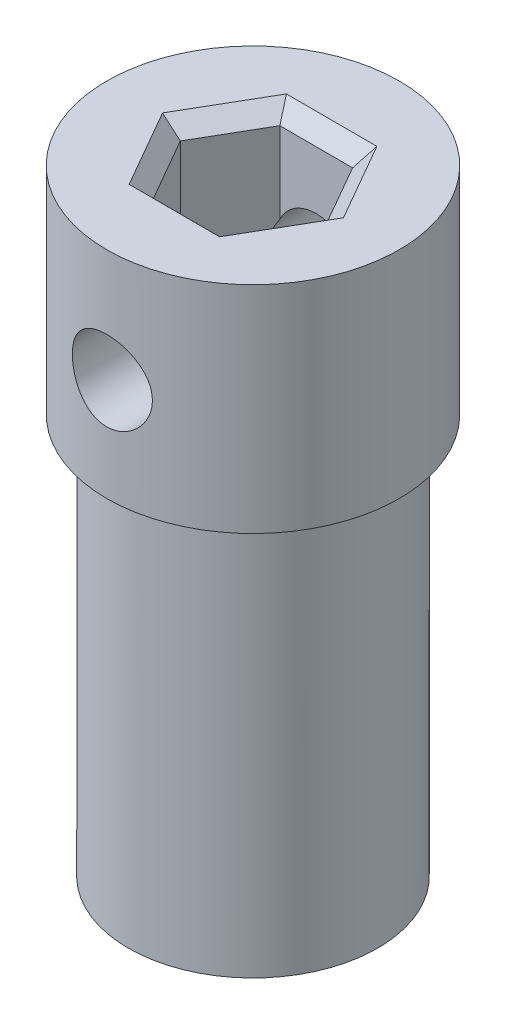
ISO-10303-21;
HEADER;
FILE_DESCRIPTION(('STEP AP214'),'2;1');
FILE_NAME('part.step','',(''),(''),'','','');
FILE_SCHEMA(('AUTOMOTIVE_DESIGN { 1 0 10303 214 1 1 1 1 }'));
ENDSEC;
DATA;
#1=APPLICATION_CONTEXT('core data for automotive mechanical design processes');
#2=APPLICATION_PROTOCOL_DEFINITION('international standard','automotive_design',2000,#1);
#3=PRODUCT_CONTEXT('',#1,'mechanical');
#4=PRODUCT('Part','Part','',(#3));
#5=PRODUCT_RELATED_PRODUCT_CATEGORY('part','',(#4));
#6=PRODUCT_DEFINITION_FORMATION('','',#4);
#7=PRODUCT_DEFINITION_CONTEXT('part definition',#1,'design');
#8=PRODUCT_DEFINITION('design','',#6,#7);
#9=PRODUCT_DEFINITION_SHAPE('','',#8);
#10=(LENGTH_UNIT() NAMED_UNIT(*) SI_UNIT(.MILLI.,.METRE.));
#11=(NAMED_UNIT(*) PLANE_ANGLE_UNIT() SI_UNIT($,.RADIAN.));
#12=(NAMED_UNIT(*) SI_UNIT($,.STERADIAN.) SOLID_ANGLE_UNIT());
#13=UNCERTAINTY_MEASURE_WITH_UNIT(LENGTH_MEASURE(1.E-05),#10,'distance_accuracy_value','');
#14=(GEOMETRIC_REPRESENTATION_CONTEXT(3) GLOBAL_UNCERTAINTY_ASSIGNED_CONTEXT((#13)) GLOBAL_UNIT_ASSIGNED_CONTEXT((#10,
#11,#12)) REPRESENTATION_CONTEXT('',''));
#15=CARTESIAN_POINT('',(0.,0.,0.));
#16=DIRECTION('',(0.,0.,1.));
#17=DIRECTION('',(1.,0.,0.));
#18=AXIS2_PLACEMENT_3D('',#15,#16,#17);
#19=CARTESIAN_POINT('',(1.18786890623597,20.,-2.04751087785415));
#20=DIRECTION('',(-0.00209924990421611,0.,0.999997796572492));
#21=DIRECTION('',(0.999997796572492,0.,0.00209924990421611));
#22=AXIS2_PLACEMENT_3D('',#19,#20,#21);
#23=PLANE('',#22);
#24=CARTESIAN_POINT('',(0.,16.3191525657327,-2.05000451703634));
#25=DIRECTION('',(-0.00209924990421611,0.,0.999997796572492));
#26=DIRECTION('',(-0.999997796572492,0.,-0.00209924990421611));
#27=AXIS2_PLACEMENT_3D('',#24,#25,#26);
#28=ELLIPSE('',#27,1.30000286446207,1.3);
#29=CARTESIAN_POINT('',(-1.17926198162869,15.7720317576059,-2.05248008809306));
#30=VERTEX_POINT('',#29);
#31=CARTESIAN_POINT('',(1.18786890623597,15.7909788617321,-2.04751087785415));
#32=VERTEX_POINT('',#31);
#33=EDGE_CURVE('E295',#30,#32,#28,.T.);
#34=ORIENTED_EDGE('',*,*,#33,.F.);
#35=DIRECTION('',(0.,-1.,0.));
#36=VECTOR('',#35,1.);
#37=CARTESIAN_POINT('',(-1.17926198162869,20.,-2.05248008809306));
#38=LINE('',#37,#36);
#39=CARTESIAN_POINT('',(-1.17926198162869,5.,-2.05248008809306));
#40=VERTEX_POINT('',#39);
#41=EDGE_CURVE('E179',#30,#40,#38,.T.);
#42=ORIENTED_EDGE('',*,*,#41,.T.);
#43=DIRECTION('',(-0.999997796572492,0.,-0.00209924990421611));
#44=VECTOR('',#43,1.);
#45=CARTESIAN_POINT('',(0.00430346230364303,5.,-2.04999548297361));
#46=LINE('',#45,#44);
#47=CARTESIAN_POINT('',(1.18786890623597,5.,-2.04751087785415));
#48=VERTEX_POINT('',#47);
#49=EDGE_CURVE('E173',#48,#40,#46,.T.);
#50=ORIENTED_EDGE('',*,*,#49,.F.);
#51=DIRECTION('',(0.,-1.,0.));
#52=VECTOR('',#51,1.);
#53=CARTESIAN_POINT('',(1.18786890623597,20.,-2.04751087785415));
#54=LINE('',#53,#52);
#55=EDGE_CURVE('E184',#32,#48,#54,.T.);
#56=ORIENTED_EDGE('',*,*,#55,.F.);
#57=EDGE_LOOP('',(#34,#42,#50,#56));
#58=FACE_BOUND('',#57,.T.);
#59=ADVANCED_FACE('F50',(#58),#23,.T.);
#60=CARTESIAN_POINT('',(-1.18786890623597,20.,2.04751087785415));
#61=DIRECTION('',(0.00209924990421593,0.,-0.999997796572492));
#62=DIRECTION('',(-0.999997796572492,0.,-0.00209924990421593));
#63=AXIS2_PLACEMENT_3D('',#60,#61,#62);
#64=PLANE('',#63);
#65=CARTESIAN_POINT('',(0.,16.3191525657327,2.05000451703634));
#66=DIRECTION('',(0.00209924990421593,0.,-0.999997796572492));
#67=DIRECTION('',(-0.999997796572492,0.,-0.00209924990421593));
#68=AXIS2_PLACEMENT_3D('',#65,#66,#67);
#69=ELLIPSE('',#68,1.30000286446207,1.3);
#70=CARTESIAN_POINT('',(-1.18786890623597,16.8473262697334,2.04751087785415));
#71=VERTEX_POINT('',#70);
#72=CARTESIAN_POINT('',(1.17926198162869,16.8662733738592,2.05248008809306));
#73=VERTEX_POINT('',#72);
#74=EDGE_CURVE('E78',#71,#73,#69,.T.);
#75=ORIENTED_EDGE('',*,*,#74,.F.);
#76=DIRECTION('',(0.,-1.,0.));
#77=VECTOR('',#76,1.);
#78=CARTESIAN_POINT('',(-1.18786890623597,20.,2.04751087785415));
#79=LINE('',#78,#77);
#80=CARTESIAN_POINT('',(-1.18786890623597,19.5,2.04751087785415));
#81=VERTEX_POINT('',#80);
#82=EDGE_CURVE('E172',#81,#71,#79,.T.);
#83=ORIENTED_EDGE('',*,*,#82,.F.);
#84=DIRECTION('',(0.999997796572492,0.,0.00209924990421593));
#85=VECTOR('',#84,1.);
#86=CARTESIAN_POINT('',(-1.18786890623597,19.5,2.04751087785415));
#87=LINE('',#86,#85);
#88=CARTESIAN_POINT('',(1.17926198162869,19.5,2.05248008809306));
#89=VERTEX_POINT('',#88);
#90=EDGE_CURVE('E210',#81,#89,#87,.T.);
#91=ORIENTED_EDGE('',*,*,#90,.T.);
#92=DIRECTION('',(0.,-1.,0.));
#93=VECTOR('',#92,1.);
#94=CARTESIAN_POINT('',(1.17926198162869,20.,2.05248008809306));
#95=LINE('',#94,#93);
#96=EDGE_CURVE('E169',#89,#73,#95,.T.);
#97=ORIENTED_EDGE('',*,*,#96,.T.);
#98=EDGE_LOOP('',(#75,#83,#91,#97));
#99=FACE_BOUND('',#98,.T.);
#100=ADVANCED_FACE('F264',(#99),#64,.T.);
#101=CARTESIAN_POINT('',(2.36713088786466,20.,0.00496921023891099));
#102=DIRECTION('',(-0.867073120512349,0.,0.498180894540304));
#103=DIRECTION('',(0.498180894540304,0.,0.867073120512349));
#104=AXIS2_PLACEMENT_3D('',#101,#102,#103);
#105=PLANE('',#104);
#106=CARTESIAN_POINT('',(0.,16.3191525657327,-4.11497113290881));
#107=DIRECTION('',(-0.867073120512349,0.,0.498180894540304));
#108=DIRECTION('',(-0.498180894540304,0.,-0.867073120512349));
#109=AXIS2_PLACEMENT_3D('',#106,#107,#108);
#110=ELLIPSE('',#109,2.60949388916164,1.3);
#111=CARTESIAN_POINT('',(1.18786890623597,16.8473262697332,-2.04751087785415));
#112=VERTEX_POINT('',#111);
#113=EDGE_CURVE('E219',#32,#112,#110,.T.);
#114=ORIENTED_EDGE('',*,*,#113,.F.);
#115=ORIENTED_EDGE('',*,*,#55,.T.);
#116=DIRECTION('',(-0.498180894540304,0.,-0.867073120512349));
#117=VECTOR('',#116,1.);
#118=CARTESIAN_POINT('',(1.77749989705032,5.,-1.02127083380762));
#119=LINE('',#118,#117);
#120=CARTESIAN_POINT('',(2.36713088786466,5.,0.00496921023891077));
#121=VERTEX_POINT('',#120);
#122=EDGE_CURVE('E329',#121,#48,#119,.T.);
#123=ORIENTED_EDGE('',*,*,#122,.F.);
#124=DIRECTION('',(0.,-1.,0.));
#125=VECTOR('',#124,1.);
#126=CARTESIAN_POINT('',(2.36713088786466,20.,0.00496921023891099));
#127=LINE('',#126,#125);
#128=CARTESIAN_POINT('',(2.36713088786466,19.5,0.00496921023891099));
#129=VERTEX_POINT('',#128);
#130=EDGE_CURVE('E166',#129,#121,#127,.T.);
#131=ORIENTED_EDGE('',*,*,#130,.F.);
#132=DIRECTION('',(-0.498180894540304,0.,-0.867073120512349));
#133=VECTOR('',#132,1.);
#134=CARTESIAN_POINT('',(2.36713088786466,19.5,0.00496921023891099));
#135=LINE('',#134,#133);
#136=CARTESIAN_POINT('',(1.18786890623597,19.5,-2.04751087785415));
#137=VERTEX_POINT('',#136);
#138=EDGE_CURVE('E213',#129,#137,#135,.T.);
#139=ORIENTED_EDGE('',*,*,#138,.T.);
#140=EDGE_CURVE('E183',#137,#112,#54,.T.);
#141=ORIENTED_EDGE('',*,*,#140,.T.);
#142=EDGE_LOOP('',(#114,#115,#123,#131,#139,#141));
#143=FACE_BOUND('',#142,.T.);
#144=ADVANCED_FACE('F272',(#143),#105,.T.);
#145=CARTESIAN_POINT('',(-1.17926198162869,16.8662733738594,-2.05248008809306));
#146=VERTEX_POINT('',#145);
#147=EDGE_CURVE('E68',#112,#146,#28,.T.);
#148=ORIENTED_EDGE('',*,*,#147,.F.);
#149=ORIENTED_EDGE('',*,*,#140,.F.);
#150=DIRECTION('',(-0.999997796572492,0.,-0.00209924990421611));
#151=VECTOR('',#150,1.);
#152=CARTESIAN_POINT('',(1.18786890623597,19.5,-2.04751087785415));
#153=LINE('',#152,#151);
#154=CARTESIAN_POINT('',(-1.17926198162869,19.5,-2.05248008809306));
#155=VERTEX_POINT('',#154);
#156=EDGE_CURVE('E214',#137,#155,#153,.T.);
#157=ORIENTED_EDGE('',*,*,#156,.T.);
#158=EDGE_CURVE('E182',#155,#146,#38,.T.);
#159=ORIENTED_EDGE('',*,*,#158,.T.);
#160=EDGE_LOOP('',(#148,#149,#157,#159));
#161=FACE_BOUND('',#160,.T.);
#162=ADVANCED_FACE('F268',(#161),#23,.T.);
#163=CARTESIAN_POINT('',(-1.17926198162869,20.,-2.05248008809306));
#164=DIRECTION('',(0.864973870608133,0.,0.50181690203219));
#165=DIRECTION('',(0.50181690203219,0.,-0.864973870608133));
#166=AXIS2_PLACEMENT_3D('',#163,#164,#165);
#167=PLANE('',#166);
#168=CARTESIAN_POINT('',(0.,16.3191525657327,-4.08515534590038));
#169=DIRECTION('',(0.864973870608133,0.,0.50181690203219));
#170=DIRECTION('',(0.50181690203219,0.,-0.864973870608133));
#171=AXIS2_PLACEMENT_3D('',#168,#169,#170);
#172=ELLIPSE('',#171,2.59058631691248,1.3);
#173=EDGE_CURVE('E291',#146,#30,#172,.T.);
#174=ORIENTED_EDGE('',*,*,#173,.F.);
#175=ORIENTED_EDGE('',*,*,#158,.F.);
#176=DIRECTION('',(-0.50181690203219,0.,0.864973870608133));
#177=VECTOR('',#176,1.);
#178=CARTESIAN_POINT('',(-1.17926198162869,19.5,-2.05248008809306));
#179=LINE('',#178,#177);
#180=CARTESIAN_POINT('',(-2.36713088786466,19.5,-0.00496921023891142));
#181=VERTEX_POINT('',#180);
#182=EDGE_CURVE('E207',#155,#181,#179,.T.);
#183=ORIENTED_EDGE('',*,*,#182,.T.);
#184=DIRECTION('',(0.,-1.,0.));
#185=VECTOR('',#184,1.);
#186=CARTESIAN_POINT('',(-2.36713088786466,20.,-0.00496921023891142));
#187=LINE('',#186,#185);
#188=CARTESIAN_POINT('',(-2.36713088786466,5.,-0.00496921023891142));
#189=VERTEX_POINT('',#188);
#190=EDGE_CURVE('E178',#181,#189,#187,.T.);
#191=ORIENTED_EDGE('',*,*,#190,.T.);
#192=DIRECTION('',(-0.50181690203219,0.,0.864973870608134));
#193=VECTOR('',#192,1.);
#194=CARTESIAN_POINT('',(-1.77319643474667,5.,-1.02872464916599));
#195=LINE('',#194,#193);
#196=EDGE_CURVE('E342',#40,#189,#195,.T.);
#197=ORIENTED_EDGE('',*,*,#196,.F.);
#198=ORIENTED_EDGE('',*,*,#41,.F.);
#199=EDGE_LOOP('',(#174,#175,#183,#191,#197,#198));
#200=FACE_BOUND('',#199,.T.);
#201=ADVANCED_FACE('F278',(#200),#167,.T.);
#202=CARTESIAN_POINT('',(-2.36713088786466,20.,-0.00496921023891142));
#203=DIRECTION('',(0.867073120512349,0.,-0.498180894540304));
#204=DIRECTION('',(-0.498180894540304,0.,-0.867073120512349));
#205=AXIS2_PLACEMENT_3D('',#202,#203,#204);
#206=PLANE('',#205);
#207=CARTESIAN_POINT('',(0.,16.3191525657327,4.11497113290866));
#208=DIRECTION('',(0.867073120512349,0.,-0.498180894540304));
#209=DIRECTION('',(-0.498180894540304,0.,-0.867073120512349));
#210=AXIS2_PLACEMENT_3D('',#207,#208,#209);
#211=ELLIPSE('',#210,2.60949388916164,1.3);
#212=CARTESIAN_POINT('',(-1.18786890623597,15.7909788617319,2.04751087785415));
#213=VERTEX_POINT('',#212);
#214=EDGE_CURVE('E325',#213,#71,#211,.T.);
#215=ORIENTED_EDGE('',*,*,#214,.F.);
#216=CARTESIAN_POINT('',(-1.18786890623597,5.,2.04751087785415));
#217=VERTEX_POINT('',#216);
#218=EDGE_CURVE('E165',#213,#217,#79,.T.);
#219=ORIENTED_EDGE('',*,*,#218,.T.);
#220=DIRECTION('',(0.498180894540304,0.,0.867073120512349));
#221=VECTOR('',#220,1.);
#222=CARTESIAN_POINT('',(-1.77749989705032,5.,1.02127083380762));
#223=LINE('',#222,#221);
#224=EDGE_CURVE('E341',#189,#217,#223,.T.);
#225=ORIENTED_EDGE('',*,*,#224,.F.);
#226=ORIENTED_EDGE('',*,*,#190,.F.);
#227=DIRECTION('',(0.498180894540304,0.,0.867073120512349));
#228=VECTOR('',#227,1.);
#229=CARTESIAN_POINT('',(-2.36713088786466,19.5,-0.00496921023891142));
#230=LINE('',#229,#228);
#231=EDGE_CURVE('E191',#181,#81,#230,.T.);
#232=ORIENTED_EDGE('',*,*,#231,.T.);
#233=ORIENTED_EDGE('',*,*,#82,.T.);
#234=EDGE_LOOP('',(#215,#219,#225,#226,#232,#233));
#235=FACE_BOUND('',#234,.T.);
#236=ADVANCED_FACE('F286',(#235),#206,.T.);
#237=CARTESIAN_POINT('',(1.17926198162869,15.7720317576061,2.05248008809306));
#238=VERTEX_POINT('',#237);
#239=EDGE_CURVE('E149',#238,#213,#69,.T.);
#240=ORIENTED_EDGE('',*,*,#239,.F.);
#241=CARTESIAN_POINT('',(1.17926198162869,5.,2.05248008809306));
#242=VERTEX_POINT('',#241);
#243=EDGE_CURVE('E159',#238,#242,#95,.T.);
#244=ORIENTED_EDGE('',*,*,#243,.T.);
#245=DIRECTION('',(0.999997796572492,0.,0.00209924990421593));
#246=VECTOR('',#245,1.);
#247=CARTESIAN_POINT('',(-0.00430346230364265,5.,2.04999548297361));
#248=LINE('',#247,#246);
#249=EDGE_CURVE('E339',#217,#242,#248,.T.);
#250=ORIENTED_EDGE('',*,*,#249,.F.);
#251=ORIENTED_EDGE('',*,*,#218,.F.);
#252=EDGE_LOOP('',(#240,#244,#250,#251));
#253=FACE_BOUND('',#252,.T.);
#254=ADVANCED_FACE('F158',(#253),#64,.T.);
#255=CARTESIAN_POINT('',(1.17926198162869,20.,2.05248008809306));
#256=DIRECTION('',(-0.864973870608134,0.,-0.501816902032189));
#257=DIRECTION('',(-0.501816902032189,0.,0.864973870608134));
#258=AXIS2_PLACEMENT_3D('',#255,#256,#257);
#259=PLANE('',#258);
#260=CARTESIAN_POINT('',(0.,16.3191525657327,4.08515534590052));
#261=DIRECTION('',(-0.864973870608134,0.,-0.501816902032189));
#262=DIRECTION('',(0.501816902032189,0.,-0.864973870608134));
#263=AXIS2_PLACEMENT_3D('',#260,#261,#262);
#264=ELLIPSE('',#263,2.59058631691248,1.3);
#265=EDGE_CURVE('E144',#73,#238,#264,.T.);
#266=ORIENTED_EDGE('',*,*,#265,.F.);
#267=ORIENTED_EDGE('',*,*,#96,.F.);
#268=DIRECTION('',(0.501816902032189,0.,-0.864973870608134));
#269=VECTOR('',#268,1.);
#270=CARTESIAN_POINT('',(1.17926198162869,19.5,2.05248008809306));
#271=LINE('',#270,#269);
#272=EDGE_CURVE('E211',#89,#129,#271,.T.);
#273=ORIENTED_EDGE('',*,*,#272,.T.);
#274=ORIENTED_EDGE('',*,*,#130,.T.);
#275=DIRECTION('',(0.501816902032189,0.,-0.864973870608134));
#276=VECTOR('',#275,1.);
#277=CARTESIAN_POINT('',(1.77319643474667,5.,1.02872464916599));
#278=LINE('',#277,#276);
#279=EDGE_CURVE('E170',#242,#121,#278,.T.);
#280=ORIENTED_EDGE('',*,*,#279,.F.);
#281=ORIENTED_EDGE('',*,*,#243,.F.);
#282=EDGE_LOOP('',(#266,#267,#273,#274,#280,#281));
#283=FACE_BOUND('',#282,.T.);
#284=ADVANCED_FACE('F164',(#283),#259,.T.);
#285=CARTESIAN_POINT('',(0.,20.,0.));
#286=DIRECTION('',(0.,1.,0.));
#287=DIRECTION('',(0.,0.,1.));
#288=AXIS2_PLACEMENT_3D('',#285,#286,#287);
#289=PLANE('',#288);
#290=DIRECTION('',(-0.999997796572492,0.,-0.00209924990421593));
#291=VECTOR('',#290,1.);
#292=CARTESIAN_POINT('',(-0.00535308725575063,20.,2.54999438125986));
#293=LINE('',#292,#291);
#294=CARTESIAN_POINT('',(1.46688685519667,20.,2.55308498762797));
#295=VERTEX_POINT('',#294);
#296=CARTESIAN_POINT('',(-1.47759302970817,20.,2.54690377489176));
#297=VERTEX_POINT('',#296);
#298=EDGE_CURVE('E205',#295,#297,#293,.T.);
#299=ORIENTED_EDGE('',*,*,#298,.T.);
#300=DIRECTION('',(-0.498180894540304,0.,-0.867073120512349));
#301=VECTOR('',#300,1.);
#302=CARTESIAN_POINT('',(-2.2110364573065,20.,1.27036128107778));
#303=LINE('',#302,#301);
#304=CARTESIAN_POINT('',(-2.94447988490483,20.,-0.00618121273620792));
#305=VERTEX_POINT('',#304);
#306=EDGE_CURVE('E204',#297,#305,#303,.T.);
#307=ORIENTED_EDGE('',*,*,#306,.T.);
#308=DIRECTION('',(0.50181690203219,0.,-0.864973870608133));
#309=VECTOR('',#308,1.);
#310=CARTESIAN_POINT('',(-2.20568337005075,20.,-1.27963310018209));
#311=LINE('',#310,#309);
#312=CARTESIAN_POINT('',(-1.46688685519667,20.,-2.55308498762797));
#313=VERTEX_POINT('',#312);
#314=EDGE_CURVE('E199',#305,#313,#311,.T.);
#315=ORIENTED_EDGE('',*,*,#314,.T.);
#316=DIRECTION('',(0.999997796572492,0.,0.00209924990421611));
#317=VECTOR('',#316,1.);
#318=CARTESIAN_POINT('',(0.0053530872557511,20.,-2.54999438125986));
#319=LINE('',#318,#317);
#320=CARTESIAN_POINT('',(1.47759302970817,20.,-2.54690377489176));
#321=VERTEX_POINT('',#320);
#322=EDGE_CURVE('E192',#313,#321,#319,.T.);
#323=ORIENTED_EDGE('',*,*,#322,.T.);
#324=DIRECTION('',(0.498180894540304,0.,0.867073120512349));
#325=VECTOR('',#324,1.);
#326=CARTESIAN_POINT('',(2.2110364573065,20.,-1.27036128107778));
#327=LINE('',#326,#325);
#328=CARTESIAN_POINT('',(2.94447988490483,20.,0.00618121273620698));
#329=VERTEX_POINT('',#328);
#330=EDGE_CURVE('E198',#321,#329,#327,.T.);
#331=ORIENTED_EDGE('',*,*,#330,.T.);
#332=DIRECTION('',(-0.501816902032189,0.,0.864973870608134));
#333=VECTOR('',#332,1.);
#334=CARTESIAN_POINT('',(2.20568337005075,20.,1.27963310018209));
#335=LINE('',#334,#333);
#336=EDGE_CURVE('E196',#329,#295,#335,.T.);
#337=ORIENTED_EDGE('',*,*,#336,.T.);
#338=EDGE_LOOP('',(#299,#307,#315,#323,#331,#337));
#339=FACE_BOUND('',#338,.T.);
#340=CARTESIAN_POINT('',(0.,20.,0.));
#341=DIRECTION('',(0.,1.,0.));
#342=DIRECTION('',(0.,0.,1.));
#343=AXIS2_PLACEMENT_3D('',#340,#341,#342);
#344=CIRCLE('',#343,4.75);
#345=CARTESIAN_POINT('',(0.,20.,4.75));
#346=VERTEX_POINT('',#345);
#347=EDGE_CURVE('E233',#346,#346,#344,.F.);
#348=ORIENTED_EDGE('',*,*,#347,.F.);
#349=EDGE_LOOP('',(#348));
#350=FACE_BOUND('',#349,.T.);
#351=ADVANCED_FACE('F313',(#339,#350),#289,.T.);
#352=CARTESIAN_POINT('',(0.,5.,0.));
#353=DIRECTION('',(0.,-1.,0.));
#354=DIRECTION('',(0.,0.,-1.));
#355=AXIS2_PLACEMENT_3D('',#352,#353,#354);
#356=PLANE('',#355);
#357=ORIENTED_EDGE('',*,*,#122,.T.);
#358=ORIENTED_EDGE('',*,*,#49,.T.);
#359=ORIENTED_EDGE('',*,*,#196,.T.);
#360=ORIENTED_EDGE('',*,*,#224,.T.);
#361=ORIENTED_EDGE('',*,*,#249,.T.);
#362=ORIENTED_EDGE('',*,*,#279,.T.);
#363=EDGE_LOOP('',(#357,#358,#359,#360,#361,#362));
#364=FACE_BOUND('',#363,.T.);
#365=ADVANCED_FACE('F257',(#364),#356,.F.);
#366=CARTESIAN_POINT('',(0.,33.4350288425444,0.));
#367=DIRECTION('',(0.,-1.,0.));
#368=DIRECTION('',(0.,0.,-1.));
#369=AXIS2_PLACEMENT_3D('',#366,#367,#368);
#370=CYLINDRICAL_SURFACE('',#369,4.75);
#371=CARTESIAN_POINT('',(0.,15.0191525657327,4.75));
#372=CARTESIAN_POINT('',(0.0715951003584682,15.0191541153011,4.74999899440994));
#373=CARTESIAN_POINT('',(0.143206537717279,15.0250868089565,4.74836546774173));
#374=CARTESIAN_POINT('',(0.284361914079167,15.048615970725,4.74200782452498));
#375=CARTESIAN_POINT('',(0.353904920890683,15.0662176169594,4.7372823359242));
#376=CARTESIAN_POINT('',(0.488865863752297,15.1124661183561,4.72526158229014));
#377=CARTESIAN_POINT('',(0.554289142292481,15.1410983109154,4.71796972976162));
#378=CARTESIAN_POINT('',(0.679405453502896,15.2085396003838,4.7015842748338));
#379=CARTESIAN_POINT('',(0.739098023693319,15.2473495177144,4.69249052719904));
#380=CARTESIAN_POINT('',(0.852509735939152,15.3350404564927,4.67323349477973));
#381=CARTESIAN_POINT('',(0.906069718621598,15.3841231407949,4.66305117109811));
#382=CARTESIAN_POINT('',(1.00431011989641,15.4905355201862,4.64288504590069));
#383=CARTESIAN_POINT('',(1.04898932960238,15.5478663362155,4.63290127157846));
#384=CARTESIAN_POINT('',(1.1289881717719,15.6704332715712,4.61406659652621));
#385=CARTESIAN_POINT('',(1.16412246881579,15.7357943785959,4.60523964721438));
#386=CARTESIAN_POINT('',(1.22283955196175,15.8717768820564,4.58999892053115));
#387=CARTESIAN_POINT('',(1.24642459490571,15.9423972476698,4.58358467175034));
#388=CARTESIAN_POINT('',(1.28081663959482,16.0851257171666,4.57409253234305));
#389=CARTESIAN_POINT('',(1.29191322126778,16.1571588999447,4.57093917601155));
#390=CARTESIAN_POINT('',(1.30191648215987,16.3021281584736,4.56810057125313));
#391=CARTESIAN_POINT('',(1.30082557129907,16.3750640528756,4.56841463718784));
#392=CARTESIAN_POINT('',(1.28671421367188,16.5174896160399,4.57240798168314));
#393=CARTESIAN_POINT('',(1.27404658503496,16.5870174797495,4.57598772797946));
#394=CARTESIAN_POINT('',(1.23770745870347,16.7229212005909,4.58594938346629));
#395=CARTESIAN_POINT('',(1.21403503985192,16.7892967933487,4.59233152722927));
#396=CARTESIAN_POINT('',(1.15607648350299,16.917919968221,4.60726473432184));
#397=CARTESIAN_POINT('',(1.12166854684569,16.9801096806638,4.61584047283149));
#398=CARTESIAN_POINT('',(1.04330056314014,17.0979554147175,4.63418162186477));
#399=CARTESIAN_POINT('',(0.99933854590106,17.1536100850557,4.64394727758393));
#400=CARTESIAN_POINT('',(0.901316726901487,17.2588188814548,4.66398009787052));
#401=CARTESIAN_POINT('',(0.846961318710026,17.308096916348,4.67425295164488));
#402=CARTESIAN_POINT('',(0.730631864203716,17.3968963263787,4.69384182527964));
#403=CARTESIAN_POINT('',(0.668657485256591,17.4364172753104,4.70315780333174));
#404=CARTESIAN_POINT('',(0.538406899675957,17.5047112704396,4.71984573129678));
#405=CARTESIAN_POINT('',(0.470102014630273,17.5334320938325,4.72720818597995));
#406=CARTESIAN_POINT('',(0.329385290712426,17.578902150229,4.73909098809721));
#407=CARTESIAN_POINT('',(0.256974402941992,17.5956541435272,4.74361199080819));
#408=CARTESIAN_POINT('',(0.112455507060578,17.6162722768452,4.74920247292855));
#409=CARTESIAN_POINT('',(0.0404048200082267,17.6205135324254,4.75037239727299));
#410=CARTESIAN_POINT('',(-0.103379144914037,17.6170288399728,4.74941887594665));
#411=CARTESIAN_POINT('',(-0.175112456620315,17.6093042000753,4.74729579027414));
#412=CARTESIAN_POINT('',(-0.314871076949878,17.5824138988914,4.74005987984794));
#413=CARTESIAN_POINT('',(-0.382940152351009,17.5634594735669,4.73500228950889));
#414=CARTESIAN_POINT('',(-0.514924300836631,17.5148947197124,4.72247303032738));
#415=CARTESIAN_POINT('',(-0.578838911066989,17.4852832062572,4.71500109305138));
#416=CARTESIAN_POINT('',(-0.702141923591819,17.4155625669063,4.69823904122434));
#417=CARTESIAN_POINT('',(-0.761411711280475,17.3752520281184,4.68891501303483));
#418=CARTESIAN_POINT('',(-0.872476630564392,17.2855290332981,4.6695255028463));
#419=CARTESIAN_POINT('',(-0.924270200395693,17.2361146803941,4.65945986658853));
#420=CARTESIAN_POINT('',(-1.02050795705685,17.1278330474972,4.63934867361868));
#421=CARTESIAN_POINT('',(-1.0646869213105,17.0687278174159,4.6293126668116));
#422=CARTESIAN_POINT('',(-1.14250771994196,16.9437286214798,4.61072476911711));
#423=CARTESIAN_POINT('',(-1.17614997265281,16.8778349252817,4.60217281931504));
#424=CARTESIAN_POINT('',(-1.23169061965019,16.7414410919005,4.58762063029747));
#425=CARTESIAN_POINT('',(-1.2536553906961,16.6709696023547,4.58160600973182));
#426=CARTESIAN_POINT('',(-1.28536406327468,16.5271392573441,4.57281260843628));
#427=CARTESIAN_POINT('',(-1.295111293101,16.4537811938566,4.57003294645611));
#428=CARTESIAN_POINT('',(-1.30190937016433,16.3089830618886,4.56810054957139));
#429=CARTESIAN_POINT('',(-1.29938763462395,16.2375643973341,4.56882571029196));
#430=CARTESIAN_POINT('',(-1.28271663157227,16.0962123142462,4.57353380900221));
#431=CARTESIAN_POINT('',(-1.26856769416037,16.0262788536052,4.57751665450532));
#432=CARTESIAN_POINT('',(-1.22929772094044,15.8904525069768,4.58821673046088));
#433=CARTESIAN_POINT('',(-1.20427180901376,15.824530115881,4.59491022126172));
#434=CARTESIAN_POINT('',(-1.14403192755671,15.6977689396739,4.61027687969974));
#435=CARTESIAN_POINT('',(-1.10881628339131,15.6369309922873,4.61895037269155));
#436=CARTESIAN_POINT('',(-1.02792053161027,15.5200367558106,4.63763415296583));
#437=CARTESIAN_POINT('',(-0.981950946367112,15.464186051045,4.64767744149082));
#438=CARTESIAN_POINT('',(-0.881396780304759,15.3608526217622,4.66779008554348));
#439=CARTESIAN_POINT('',(-0.826810082526995,15.3133719595894,4.67785944687695));
#440=CARTESIAN_POINT('',(-0.709063460062277,15.2270544437435,4.69716556994259));
#441=CARTESIAN_POINT('',(-0.645735853814162,15.1884403978401,4.70637798882931));
#442=CARTESIAN_POINT('',(-0.513236994525068,15.1224666275332,4.72266130243398));
#443=CARTESIAN_POINT('',(-0.444069324085395,15.0951000629382,4.72973349804341));
#444=CARTESIAN_POINT('',(-0.31268558688025,15.0557470341646,4.74008364222336));
#445=CARTESIAN_POINT('',(-0.251007090363235,15.0420570006412,4.74377447109986));
#446=CARTESIAN_POINT('',(-0.126223189317632,15.0237595854062,4.748732959314));
#447=CARTESIAN_POINT('',(-0.063117943308976,15.0191511996396,4.75000088652402));
#448=CARTESIAN_POINT('',(0.,15.0191525657327,4.75));
#449=B_SPLINE_CURVE_WITH_KNOTS('',3,(#371,#372,#373,#374,#375,#376,#377,#378,#379,#380,#381,
#382,#383,#384,#385,#386,#387,#388,#389,#390,#391,#392,#393,#394,#395,#396,#397,#398,#399,#400,
#401,#402,#403,#404,#405,#406,#407,#408,#409,#410,#411,#412,#413,#414,#415,#416,#417,#418,#419,
#420,#421,#422,#423,#424,#425,#426,#427,#428,#429,#430,#431,#432,#433,#434,#435,#436,#437,#438,
#439,#440,#441,#442,#443,#444,#445,#446,#447,#448),.UNSPECIFIED.,.T.,.F.,(4,2,2,2,2,2,2,2,2,2,2,
2,2,2,2,2,2,2,2,2,2,2,2,2,2,2,2,2,2,2,2,2,2,2,2,2,2,2,4),(0.,0.214553756688464,
0.429202785825955,0.643567466942959,0.857949433208487,1.0770191770696,1.29611872119019,
1.51920969740667,1.74225706196029,1.96001843669451,2.17773675267682,2.38903333215547,
2.60034760141902,2.81415229883656,3.0280011278091,3.24921438650876,3.47043730646332,
3.6927165751415,3.91494456441531,4.13043803387268,4.34590794682475,4.55744802377737,
4.76901162841968,4.98488167425051,5.20079674975647,5.42315056701215,5.6454955551614,
5.86656280611601,6.08756982099399,6.30093382834366,6.51429177844098,6.72582022678132,
6.93738345860129,7.15547761247439,7.37362542897072,7.59676812915135,7.81977492286229,
8.00894553984856,8.19809524120503),.UNSPECIFIED.);
#450=CARTESIAN_POINT('',(0.,15.0191525657327,4.75));
#451=VERTEX_POINT('',#450);
#452=EDGE_CURVE('E11',#451,#451,#449,.T.);
#453=ORIENTED_EDGE('',*,*,#452,.F.);
#454=EDGE_LOOP('',(#453));
#455=FACE_BOUND('',#454,.T.);
#456=CARTESIAN_POINT('',(0.,17.6191525657327,-4.75));
#457=CARTESIAN_POINT('',(0.0715951003584682,17.6191510161642,-4.74999899440994));
#458=CARTESIAN_POINT('',(0.143206537717279,17.6132183225089,-4.74836546774173));
#459=CARTESIAN_POINT('',(0.284361914079166,17.5896891607403,-4.74200782452498));
#460=CARTESIAN_POINT('',(0.353904920890683,17.5720875145059,-4.7372823359242));
#461=CARTESIAN_POINT('',(0.488865863752298,17.5258390131093,-4.72526158229014));
#462=CARTESIAN_POINT('',(0.554289142292483,17.4972068205499,-4.71796972976162));
#463=CARTESIAN_POINT('',(0.679405453502898,17.4297655310815,-4.7015842748338));
#464=CARTESIAN_POINT('',(0.73909802369332,17.3909556137509,-4.69249052719904));
#465=CARTESIAN_POINT('',(0.852509735939154,17.3032646749726,-4.67323349477973));
#466=CARTESIAN_POINT('',(0.9060697186216,17.2541819906704,-4.66305117109811));
#467=CARTESIAN_POINT('',(1.00431011989641,17.1477696112791,-4.64288504590069));
#468=CARTESIAN_POINT('',(1.04898932960238,17.0904387952498,-4.63290127157847));
#469=CARTESIAN_POINT('',(1.1289881717719,16.9678718598942,-4.61406659652621));
#470=CARTESIAN_POINT('',(1.16412246881579,16.9025107528695,-4.60523964721438));
#471=CARTESIAN_POINT('',(1.22283955196175,16.7665282494089,-4.58999892053115));
#472=CARTESIAN_POINT('',(1.24642459490571,16.6959078837956,-4.58358467175034));
#473=CARTESIAN_POINT('',(1.28081663959482,16.5531794142987,-4.57409253234305));
#474=CARTESIAN_POINT('',(1.29191322126778,16.4811462315206,-4.57093917601155));
#475=CARTESIAN_POINT('',(1.30191648215987,16.3361769729918,-4.56810057125313));
#476=CARTESIAN_POINT('',(1.30082557129907,16.2632410785897,-4.56841463718784));
#477=CARTESIAN_POINT('',(1.28671421367188,16.1208155154254,-4.57240798168314));
#478=CARTESIAN_POINT('',(1.27404658503496,16.0512876517158,-4.57598772797945));
#479=CARTESIAN_POINT('',(1.23770745870347,15.9153839308745,-4.58594938346629));
#480=CARTESIAN_POINT('',(1.21403503985192,15.8490083381166,-4.59233152722927));
#481=CARTESIAN_POINT('',(1.15607648350299,15.7203851632443,-4.60726473432184));
#482=CARTESIAN_POINT('',(1.12166854684569,15.6581954508015,-4.61584047283149));
#483=CARTESIAN_POINT('',(1.04330056314014,15.5403497167479,-4.63418162186477));
#484=CARTESIAN_POINT('',(0.999338545901057,15.4846950464096,-4.64394727758393));
#485=CARTESIAN_POINT('',(0.901316726901483,15.3794862500105,-4.66398009787052));
#486=CARTESIAN_POINT('',(0.846961318710021,15.3302082151173,-4.67425295164488));
#487=CARTESIAN_POINT('',(0.730631864203712,15.2414088050866,-4.69384182527964));
#488=CARTESIAN_POINT('',(0.668657485256588,15.2018878561549,-4.70315780333174));
#489=CARTESIAN_POINT('',(0.538406899675955,15.1335938610257,-4.71984573129678));
#490=CARTESIAN_POINT('',(0.470102014630271,15.1048730376328,-4.72720818597995));
#491=CARTESIAN_POINT('',(0.329385290712425,15.0594029812363,-4.73909098809721));
#492=CARTESIAN_POINT('',(0.256974402941993,15.0426509879382,-4.74361199080819));
#493=CARTESIAN_POINT('',(0.11245550706058,15.0220328546201,-4.74920247292855));
#494=CARTESIAN_POINT('',(0.0404048200082283,15.01779159904,-4.75037239727299));
#495=CARTESIAN_POINT('',(-0.103379144914035,15.0212762914925,-4.74941887594665));
#496=CARTESIAN_POINT('',(-0.175112456620315,15.02900093139,-4.74729579027414));
#497=CARTESIAN_POINT('',(-0.314871076949878,15.0558912325739,-4.74005987984794));
#498=CARTESIAN_POINT('',(-0.382940152351009,15.0748456578985,-4.73500228950889));
#499=CARTESIAN_POINT('',(-0.514924300836631,15.1234104117529,-4.72247303032738));
#500=CARTESIAN_POINT('',(-0.578838911066989,15.1530219252082,-4.71500109305138));
#501=CARTESIAN_POINT('',(-0.702141923591819,15.222742564559,-4.69823904122434));
#502=CARTESIAN_POINT('',(-0.761411711280473,15.2630531033469,-4.68891501303483));
#503=CARTESIAN_POINT('',(-0.872476630564391,15.3527760981672,-4.6695255028463));
#504=CARTESIAN_POINT('',(-0.924270200395693,15.4021904510712,-4.65945986658853));
#505=CARTESIAN_POINT('',(-1.02050795705685,15.5104720839681,-4.63934867361868));
#506=CARTESIAN_POINT('',(-1.0646869213105,15.5695773140494,-4.6293126668116));
#507=CARTESIAN_POINT('',(-1.14250771994196,15.6945765099855,-4.61072476911711));
#508=CARTESIAN_POINT('',(-1.17614997265281,15.7604702061837,-4.60217281931504));
#509=CARTESIAN_POINT('',(-1.23169061965019,15.8968640395648,-4.58762063029747));
#510=CARTESIAN_POINT('',(-1.2536553906961,15.9673355291106,-4.58160600973182));
#511=CARTESIAN_POINT('',(-1.28536406327468,16.1111658741212,-4.57281260843628));
#512=CARTESIAN_POINT('',(-1.295111293101,16.1845239376088,-4.57003294645611));
#513=CARTESIAN_POINT('',(-1.30190937016433,16.3293220695768,-4.56810054957139));
#514=CARTESIAN_POINT('',(-1.29938763462395,16.4007407341313,-4.56882571029196));
#515=CARTESIAN_POINT('',(-1.28271663157227,16.5420928172192,-4.57353380900221));
#516=CARTESIAN_POINT('',(-1.26856769416037,16.6120262778601,-4.57751665450532));
#517=CARTESIAN_POINT('',(-1.22929772094044,16.7478526244885,-4.58821673046088));
#518=CARTESIAN_POINT('',(-1.20427180901376,16.8137750155844,-4.59491022126172));
#519=CARTESIAN_POINT('',(-1.14403192755671,16.9405361917914,-4.61027687969974));
#520=CARTESIAN_POINT('',(-1.10881628339131,17.001374139178,-4.61895037269155));
#521=CARTESIAN_POINT('',(-1.02792053161027,17.1182683756547,-4.63763415296583));
#522=CARTESIAN_POINT('',(-0.981950946367111,17.1741190804204,-4.64767744149082));
#523=CARTESIAN_POINT('',(-0.881396780304758,17.2774525097031,-4.66779008554348));
#524=CARTESIAN_POINT('',(-0.826810082526994,17.324933171876,-4.67785944687695));
#525=CARTESIAN_POINT('',(-0.709063460062278,17.4112506877218,-4.69716556994259));
#526=CARTESIAN_POINT('',(-0.645735853814163,17.4498647336252,-4.70637798882931));
#527=CARTESIAN_POINT('',(-0.51323699452507,17.5158385039321,-4.72266130243398));
#528=CARTESIAN_POINT('',(-0.444069324085397,17.5432050685272,-4.72973349804341));
#529=CARTESIAN_POINT('',(-0.312685586880252,17.5825580973007,-4.74008364222336));
#530=CARTESIAN_POINT('',(-0.251007090363238,17.5962481308242,-4.74377447109986));
#531=CARTESIAN_POINT('',(-0.126223189317634,17.6145455460591,-4.748732959314));
#532=CARTESIAN_POINT('',(-0.0631179433089767,17.6191539318258,-4.75000088652402));
#533=CARTESIAN_POINT('',(0.,17.6191525657327,-4.75));
#534=B_SPLINE_CURVE_WITH_KNOTS('',3,(#456,#457,#458,#459,#460,#461,#462,#463,#464,#465,#466,
#467,#468,#469,#470,#471,#472,#473,#474,#475,#476,#477,#478,#479,#480,#481,#482,#483,#484,#485,
#486,#487,#488,#489,#490,#491,#492,#493,#494,#495,#496,#497,#498,#499,#500,#501,#502,#503,#504,
#505,#506,#507,#508,#509,#510,#511,#512,#513,#514,#515,#516,#517,#518,#519,#520,#521,#522,#523,
#524,#525,#526,#527,#528,#529,#530,#531,#532,#533),.UNSPECIFIED.,.T.,.F.,(4,2,2,2,2,2,2,2,2,2,2,
2,2,2,2,2,2,2,2,2,2,2,2,2,2,2,2,2,2,2,2,2,2,2,2,2,2,2,4),(0.,0.214553756688464,
0.429202785825955,0.643567466942962,0.857949433208488,1.0770191770696,1.29611872119019,
1.51920969740667,1.74225706196029,1.96001843669451,2.17773675267682,2.38903333215548,
2.60034760141903,2.81415229883656,3.02800112780911,3.24921438650876,3.47043730646332,
3.6927165751415,3.9149445644153,4.13043803387268,4.34590794682475,4.55744802377737,
4.76901162841968,4.98488167425051,5.20079674975647,5.42315056701214,5.6454955551614,
5.86656280611601,6.08756982099399,6.30093382834366,6.51429177844098,6.72582022678132,
6.93738345860129,7.15547761247439,7.37362542897072,7.59676812915135,7.81977492286229,
8.00894553984856,8.19809524120503),.UNSPECIFIED.);
#535=CARTESIAN_POINT('',(0.,17.6191525657327,-4.75));
#536=VERTEX_POINT('',#535);
#537=EDGE_CURVE('E63',#536,#536,#534,.T.);
#538=ORIENTED_EDGE('',*,*,#537,.F.);
#539=EDGE_LOOP('',(#538));
#540=FACE_BOUND('',#539,.T.);
#541=CARTESIAN_POINT('',(0.,13.,0.));
#542=DIRECTION('',(0.,-1.,0.));
#543=DIRECTION('',(0.,0.,-1.));
#544=AXIS2_PLACEMENT_3D('',#541,#542,#543);
#545=CIRCLE('',#544,4.75);
#546=CARTESIAN_POINT('',(0.,13.,-4.75));
#547=VERTEX_POINT('',#546);
#548=EDGE_CURVE('E330',#547,#547,#545,.T.);
#549=ORIENTED_EDGE('',*,*,#548,.F.);
#550=EDGE_LOOP('',(#549));
#551=FACE_BOUND('',#550,.T.);
#552=ORIENTED_EDGE('',*,*,#347,.T.);
#553=EDGE_LOOP('',(#552));
#554=FACE_BOUND('',#553,.T.);
#555=ADVANCED_FACE('F236',(#455,#540,#551,#554),#370,.T.);
#556=CARTESIAN_POINT('',(0.,13.,0.));
#557=DIRECTION('',(0.,-1.,0.));
#558=DIRECTION('',(0.,0.,-1.));
#559=AXIS2_PLACEMENT_3D('',#556,#557,#558);
#560=PLANE('',#559);
#561=CARTESIAN_POINT('',(0.,13.,0.));
#562=DIRECTION('',(0.,-1.,0.));
#563=DIRECTION('',(0.,0.,-1.));
#564=AXIS2_PLACEMENT_3D('',#561,#562,#563);
#565=CIRCLE('',#564,4.05);
#566=CARTESIAN_POINT('',(0.,13.,-4.05));
#567=VERTEX_POINT('',#566);
#568=EDGE_CURVE('E332',#567,#567,#565,.T.);
#569=ORIENTED_EDGE('',*,*,#568,.F.);
#570=EDGE_LOOP('',(#569));
#571=FACE_BOUND('',#570,.T.);
#572=ORIENTED_EDGE('',*,*,#548,.T.);
#573=EDGE_LOOP('',(#572));
#574=FACE_BOUND('',#573,.T.);
#575=ADVANCED_FACE('F246',(#571,#574),#560,.T.);
#576=CARTESIAN_POINT('',(0.,0.,0.));
#577=DIRECTION('',(0.,1.,0.));
#578=DIRECTION('',(0.,0.,1.));
#579=AXIS2_PLACEMENT_3D('',#576,#577,#578);
#580=PLANE('',#579);
#581=CARTESIAN_POINT('',(0.,0.,0.));
#582=DIRECTION('',(0.,1.,0.));
#583=DIRECTION('',(0.,0.,1.));
#584=AXIS2_PLACEMENT_3D('',#581,#582,#583);
#585=CIRCLE('',#584,4.05);
#586=CARTESIAN_POINT('',(0.,0.,4.05));
#587=VERTEX_POINT('',#586);
#588=EDGE_CURVE('E186',#587,#587,#585,.T.);
#589=ORIENTED_EDGE('',*,*,#588,.F.);
#590=EDGE_LOOP('',(#589));
#591=FACE_BOUND('',#590,.T.);
#592=ADVANCED_FACE('F247',(#591),#580,.F.);
#593=CARTESIAN_POINT('',(0.,20.,0.));
#594=DIRECTION('',(0.,-1.,0.));
#595=DIRECTION('',(0.,0.,-1.));
#596=AXIS2_PLACEMENT_3D('',#593,#594,#595);
#597=CYLINDRICAL_SURFACE('',#596,4.05);
#598=ORIENTED_EDGE('',*,*,#568,.T.);
#599=EDGE_LOOP('',(#598));
#600=FACE_BOUND('',#599,.T.);
#601=ORIENTED_EDGE('',*,*,#588,.T.);
#602=EDGE_LOOP('',(#601));
#603=FACE_BOUND('',#602,.T.);
#604=ADVANCED_FACE('F258',(#600,#603),#597,.T.);
#605=CARTESIAN_POINT('',(2.36713088786466,19.5,0.00496921023891099));
#606=DIRECTION('',(0.613113283298859,-0.707106781186552,-0.352267088787027));
#607=DIRECTION('',(-0.498180894540304,0.,-0.867073120512349));
#608=AXIS2_PLACEMENT_3D('',#605,#606,#607);
#609=PLANE('',#608);
#610=DIRECTION('',(0.755927280383825,0.654653670707973,0.00158688376752409));
#611=VECTOR('',#610,1.);
#612=CARTESIAN_POINT('',(1.69080777704618,18.9142857142857,0.00354943588493561));
#613=LINE('',#612,#611);
#614=EDGE_CURVE('E226',#329,#129,#613,.F.);
#615=ORIENTED_EDGE('',*,*,#614,.F.);
#616=ORIENTED_EDGE('',*,*,#330,.F.);
#617=DIRECTION('',(0.379337921847441,0.654653670707973,-0.653858786342312));
#618=VECTOR('',#617,1.);
#619=CARTESIAN_POINT('',(0.848477790168549,18.9142857142857,-1.46250776989582));
#620=LINE('',#619,#618);
#621=EDGE_CURVE('E231',#137,#321,#620,.T.);
#622=ORIENTED_EDGE('',*,*,#621,.F.);
#623=ORIENTED_EDGE('',*,*,#138,.F.);
#624=EDGE_LOOP('',(#615,#616,#622,#623));
#625=FACE_BOUND('',#624,.T.);
#626=ADVANCED_FACE('F49',(#625),#609,.F.);
#627=CARTESIAN_POINT('',(1.18786890623597,19.5,-2.04751087785415));
#628=DIRECTION('',(0.00148439384267641,-0.707106781186551,-0.707105223128011));
#629=DIRECTION('',(-0.999997796572492,0.,-0.00209924990421611));
#630=AXIS2_PLACEMENT_3D('',#627,#628,#629);
#631=PLANE('',#630);
#632=ORIENTED_EDGE('',*,*,#621,.T.);
#633=ORIENTED_EDGE('',*,*,#322,.F.);
#634=DIRECTION('',(0.376589358536385,-0.654653670707973,0.655445670109836));
#635=VECTOR('',#634,1.);
#636=CARTESIAN_POINT('',(-1.17926198162869,19.5,-2.05248008809306));
#637=LINE('',#636,#635);
#638=EDGE_CURVE('E223',#155,#313,#637,.F.);
#639=ORIENTED_EDGE('',*,*,#638,.F.);
#640=ORIENTED_EDGE('',*,*,#156,.F.);
#641=EDGE_LOOP('',(#632,#633,#639,#640));
#642=FACE_BOUND('',#641,.T.);
#643=ADVANCED_FACE('F316',(#642),#631,.F.);
#644=CARTESIAN_POINT('',(1.17926198162869,19.5,2.05248008809306));
#645=DIRECTION('',(0.611628889456183,-0.707106781186552,0.354838134340984));
#646=DIRECTION('',(0.501816902032189,0.,-0.864973870608134));
#647=AXIS2_PLACEMENT_3D('',#644,#645,#646);
#648=PLANE('',#647);
#649=ORIENTED_EDGE('',*,*,#614,.T.);
#650=ORIENTED_EDGE('',*,*,#272,.F.);
#651=DIRECTION('',(0.376589358536385,0.654653670707973,0.655445670109835));
#652=VECTOR('',#651,1.);
#653=CARTESIAN_POINT('',(0.842329986877629,18.9142857142857,1.46605720578075));
#654=LINE('',#653,#652);
#655=EDGE_CURVE('E225',#295,#89,#654,.F.);
#656=ORIENTED_EDGE('',*,*,#655,.F.);
#657=ORIENTED_EDGE('',*,*,#336,.F.);
#658=EDGE_LOOP('',(#649,#650,#656,#657));
#659=FACE_BOUND('',#658,.T.);
#660=ADVANCED_FACE('F307',(#659),#648,.F.);
#661=CARTESIAN_POINT('',(-1.17926198162869,19.5,-2.05248008809306));
#662=DIRECTION('',(-0.611628889456183,-0.707106781186552,-0.354838134340984));
#663=DIRECTION('',(-0.50181690203219,0.,0.864973870608133));
#664=AXIS2_PLACEMENT_3D('',#661,#662,#663);
#665=PLANE('',#664);
#666=ORIENTED_EDGE('',*,*,#638,.T.);
#667=ORIENTED_EDGE('',*,*,#314,.F.);
#668=DIRECTION('',(0.755927280383825,-0.654653670707973,0.0015868837675244));
#669=VECTOR('',#668,1.);
#670=CARTESIAN_POINT('',(-2.36713088786466,19.5,-0.00496921023891157));
#671=LINE('',#670,#669);
#672=EDGE_CURVE('E218',#181,#305,#671,.F.);
#673=ORIENTED_EDGE('',*,*,#672,.F.);
#674=ORIENTED_EDGE('',*,*,#182,.F.);
#675=EDGE_LOOP('',(#666,#667,#673,#674));
#676=FACE_BOUND('',#675,.T.);
#677=ADVANCED_FACE('F356',(#676),#665,.F.);
#678=CARTESIAN_POINT('',(-1.18786890623597,19.5,2.04751087785415));
#679=DIRECTION('',(-0.00148439384267628,-0.707106781186551,0.707105223128011));
#680=DIRECTION('',(0.999997796572492,0.,0.00209924990421593));
#681=AXIS2_PLACEMENT_3D('',#678,#679,#680);
#682=PLANE('',#681);
#683=ORIENTED_EDGE('',*,*,#655,.T.);
#684=ORIENTED_EDGE('',*,*,#90,.F.);
#685=DIRECTION('',(-0.379337921847441,0.654653670707973,0.653858786342313));
#686=VECTOR('',#685,1.);
#687=CARTESIAN_POINT('',(-0.848477790168549,18.9142857142857,1.46250776989582));
#688=LINE('',#687,#686);
#689=EDGE_CURVE('E220',#297,#81,#688,.F.);
#690=ORIENTED_EDGE('',*,*,#689,.F.);
#691=ORIENTED_EDGE('',*,*,#298,.F.);
#692=EDGE_LOOP('',(#683,#684,#690,#691));
#693=FACE_BOUND('',#692,.T.);
#694=ADVANCED_FACE('F363',(#693),#682,.F.);
#695=CARTESIAN_POINT('',(-2.36713088786466,19.5,-0.00496921023891142));
#696=DIRECTION('',(-0.613113283298859,-0.707106781186551,0.352267088787027));
#697=DIRECTION('',(0.498180894540304,0.,0.867073120512349));
#698=AXIS2_PLACEMENT_3D('',#695,#696,#697);
#699=PLANE('',#698);
#700=ORIENTED_EDGE('',*,*,#672,.T.);
#701=ORIENTED_EDGE('',*,*,#306,.F.);
#702=ORIENTED_EDGE('',*,*,#689,.T.);
#703=ORIENTED_EDGE('',*,*,#231,.F.);
#704=EDGE_LOOP('',(#700,#701,#702,#703));
#705=FACE_BOUND('',#704,.T.);
#706=ADVANCED_FACE('F242',(#705),#699,.F.);
#707=CARTESIAN_POINT('',(0.,16.3191525657327,4.75));
#708=DIRECTION('',(0.,0.,-1.));
#709=DIRECTION('',(-1.,0.,0.));
#710=AXIS2_PLACEMENT_3D('',#707,#708,#709);
#711=CYLINDRICAL_SURFACE('',#710,1.3);
#712=ORIENTED_EDGE('',*,*,#214,.T.);
#713=ORIENTED_EDGE('',*,*,#74,.T.);
#714=ORIENTED_EDGE('',*,*,#265,.T.);
#715=ORIENTED_EDGE('',*,*,#239,.T.);
#716=EDGE_LOOP('',(#712,#713,#714,#715));
#717=FACE_BOUND('',#716,.T.);
#718=ORIENTED_EDGE('',*,*,#452,.T.);
#719=EDGE_LOOP('',(#718));
#720=FACE_BOUND('',#719,.T.);
#721=ADVANCED_FACE('F150',(#717,#720),#711,.F.);
#722=ORIENTED_EDGE('',*,*,#113,.T.);
#723=ORIENTED_EDGE('',*,*,#147,.T.);
#724=ORIENTED_EDGE('',*,*,#173,.T.);
#725=ORIENTED_EDGE('',*,*,#33,.T.);
#726=EDGE_LOOP('',(#722,#723,#724,#725));
#727=FACE_BOUND('',#726,.T.);
#728=ORIENTED_EDGE('',*,*,#537,.T.);
#729=EDGE_LOOP('',(#728));
#730=FACE_BOUND('',#729,.T.);
#731=ADVANCED_FACE('F244',(#727,#730),#711,.F.);
#732=CLOSED_SHELL('',(#59,#100,#144,#162,#201,#236,#254,#284,#351,#365,#555,#575,#592,#604,#626,
#643,#660,#677,#694,#706,#721,#731));
#733=MANIFOLD_SOLID_BREP('B2',#732);
#734=ADVANCED_BREP_SHAPE_REPRESENTATION('',(#18,#733),#14);
#735=SHAPE_DEFINITION_REPRESENTATION(#9,#734);
ENDSEC;
END-ISO-10303-21;
